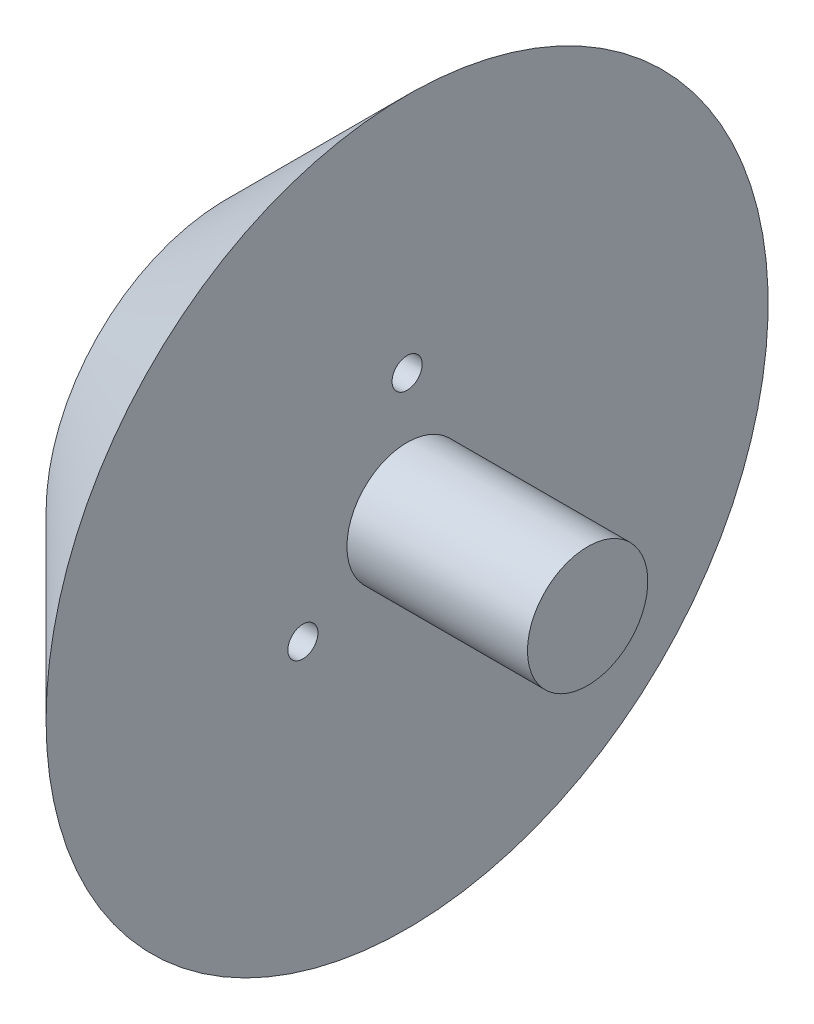
ISO-10303-21;
HEADER;
FILE_DESCRIPTION(('STEP AP214'),'2;1');
FILE_NAME('part.step','',(''),(''),'','','');
FILE_SCHEMA(('AUTOMOTIVE_DESIGN { 1 0 10303 214 1 1 1 1 }'));
ENDSEC;
DATA;
#1=APPLICATION_CONTEXT('core data for automotive mechanical design processes');
#2=APPLICATION_PROTOCOL_DEFINITION('international standard','automotive_design',2000,#1);
#3=PRODUCT_CONTEXT('',#1,'mechanical');
#4=PRODUCT('Part','Part','',(#3));
#5=PRODUCT_RELATED_PRODUCT_CATEGORY('part','',(#4));
#6=PRODUCT_DEFINITION_FORMATION('','',#4);
#7=PRODUCT_DEFINITION_CONTEXT('part definition',#1,'design');
#8=PRODUCT_DEFINITION('design','',#6,#7);
#9=PRODUCT_DEFINITION_SHAPE('','',#8);
#10=(LENGTH_UNIT() NAMED_UNIT(*) SI_UNIT(.MILLI.,.METRE.));
#11=(NAMED_UNIT(*) PLANE_ANGLE_UNIT() SI_UNIT($,.RADIAN.));
#12=(NAMED_UNIT(*) SI_UNIT($,.STERADIAN.) SOLID_ANGLE_UNIT());
#13=UNCERTAINTY_MEASURE_WITH_UNIT(LENGTH_MEASURE(1.E-05),#10,'distance_accuracy_value','');
#14=(GEOMETRIC_REPRESENTATION_CONTEXT(3) GLOBAL_UNCERTAINTY_ASSIGNED_CONTEXT((#13)) GLOBAL_UNIT_ASSIGNED_CONTEXT((#10,
#11,#12)) REPRESENTATION_CONTEXT('',''));
#15=CARTESIAN_POINT('',(0.,0.,0.));
#16=DIRECTION('',(0.,0.,1.));
#17=DIRECTION('',(1.,0.,0.));
#18=AXIS2_PLACEMENT_3D('',#15,#16,#17);
#19=CARTESIAN_POINT('',(3.49999999999988,0.,7.75));
#20=DIRECTION('',(-1.,0.,0.));
#21=DIRECTION('',(0.,0.,1.));
#22=AXIS2_PLACEMENT_3D('',#19,#20,#21);
#23=PLANE('',#22);
#24=CARTESIAN_POINT('',(3.49999999999988,1.,7.75));
#25=DIRECTION('',(-1.,0.,0.));
#26=DIRECTION('',(0.,0.,1.));
#27=AXIS2_PLACEMENT_3D('',#24,#25,#26);
#28=CIRCLE('',#27,0.124999999999999);
#29=CARTESIAN_POINT('',(3.49999999999988,1.,7.875));
#30=VERTEX_POINT('',#29);
#31=EDGE_CURVE('E59',#30,#30,#28,.T.);
#32=ORIENTED_EDGE('',*,*,#31,.T.);
#33=EDGE_LOOP('',(#32));
#34=FACE_BOUND('',#33,.T.);
#35=CARTESIAN_POINT('',(3.49999999999988,-0.499999999999981,8.61602540378448));
#36=DIRECTION('',(-1.,0.,0.));
#37=DIRECTION('',(0.,0.,1.));
#38=AXIS2_PLACEMENT_3D('',#35,#36,#37);
#39=CIRCLE('',#38,0.124999999999998);
#40=CARTESIAN_POINT('',(3.49999999999988,-0.499999999999981,8.74102540378448));
#41=VERTEX_POINT('',#40);
#42=EDGE_CURVE('E62',#41,#41,#39,.T.);
#43=ORIENTED_EDGE('',*,*,#42,.T.);
#44=EDGE_LOOP('',(#43));
#45=FACE_BOUND('',#44,.T.);
#46=CARTESIAN_POINT('',(3.49999999999988,-0.500000000000016,6.8839745962156));
#47=DIRECTION('',(-1.,0.,0.));
#48=DIRECTION('',(0.,0.,1.));
#49=AXIS2_PLACEMENT_3D('',#46,#47,#48);
#50=CIRCLE('',#49,0.124999999999999);
#51=CARTESIAN_POINT('',(3.49999999999988,-0.500000000000016,7.0089745962156));
#52=VERTEX_POINT('',#51);
#53=EDGE_CURVE('E65',#52,#52,#50,.T.);
#54=ORIENTED_EDGE('',*,*,#53,.T.);
#55=EDGE_LOOP('',(#54));
#56=FACE_BOUND('',#55,.T.);
#57=CARTESIAN_POINT('',(3.49999999999988,0.,7.75));
#58=DIRECTION('',(-1.,0.,0.));
#59=DIRECTION('',(0.,0.,1.));
#60=AXIS2_PLACEMENT_3D('',#57,#58,#59);
#61=CIRCLE('',#60,0.500000000000002);
#62=CARTESIAN_POINT('',(3.49999999999988,0.,8.25));
#63=VERTEX_POINT('',#62);
#64=EDGE_CURVE('E10',#63,#63,#61,.T.);
#65=ORIENTED_EDGE('',*,*,#64,.T.);
#66=EDGE_LOOP('',(#65));
#67=FACE_BOUND('',#66,.T.);
#68=CARTESIAN_POINT('',(3.49999999999988,0.,7.75));
#69=DIRECTION('',(-1.,0.,0.));
#70=DIRECTION('',(0.,0.,1.));
#71=AXIS2_PLACEMENT_3D('',#68,#69,#70);
#72=CIRCLE('',#71,3.);
#73=CARTESIAN_POINT('',(3.49999999999988,0.,10.75));
#74=VERTEX_POINT('',#73);
#75=EDGE_CURVE('E54',#74,#74,#72,.T.);
#76=ORIENTED_EDGE('',*,*,#75,.F.);
#77=EDGE_LOOP('',(#76));
#78=FACE_BOUND('',#77,.T.);
#79=ADVANCED_FACE('F39',(#34,#45,#56,#67,#78),#23,.F.);
#80=CARTESIAN_POINT('',(4.99999999999988,0.,7.75));
#81=DIRECTION('',(-1.,0.,0.));
#82=DIRECTION('',(0.,0.,1.));
#83=AXIS2_PLACEMENT_3D('',#80,#81,#82);
#84=CYLINDRICAL_SURFACE('',#83,0.500000000000002);
#85=CARTESIAN_POINT('',(4.99999999999988,0.,7.75));
#86=DIRECTION('',(-1.,0.,0.));
#87=DIRECTION('',(0.,0.,1.));
#88=AXIS2_PLACEMENT_3D('',#85,#86,#87);
#89=CIRCLE('',#88,0.500000000000002);
#90=CARTESIAN_POINT('',(4.99999999999988,0.,8.25));
#91=VERTEX_POINT('',#90);
#92=EDGE_CURVE('E46',#91,#91,#89,.T.);
#93=ORIENTED_EDGE('',*,*,#92,.T.);
#94=EDGE_LOOP('',(#93));
#95=FACE_BOUND('',#94,.T.);
#96=ORIENTED_EDGE('',*,*,#64,.F.);
#97=EDGE_LOOP('',(#96));
#98=FACE_BOUND('',#97,.T.);
#99=ADVANCED_FACE('F98',(#95,#98),#84,.T.);
#100=CARTESIAN_POINT('',(4.99999999999988,0.,7.75));
#101=DIRECTION('',(-1.,0.,0.));
#102=DIRECTION('',(0.,0.,1.));
#103=AXIS2_PLACEMENT_3D('',#100,#101,#102);
#104=PLANE('',#103);
#105=ORIENTED_EDGE('',*,*,#92,.F.);
#106=EDGE_LOOP('',(#105));
#107=FACE_BOUND('',#106,.T.);
#108=ADVANCED_FACE('F93',(#107),#104,.F.);
#109=CARTESIAN_POINT('',(3.49999999999988,0.,7.75));
#110=DIRECTION('',(1.,0.,0.));
#111=DIRECTION('',(0.,0.,-1.));
#112=AXIS2_PLACEMENT_3D('',#109,#110,#111);
#113=CONICAL_SURFACE('',#112,3.,0.785398163397443);
#114=CARTESIAN_POINT('',(1.99999999999988,0.,7.75));
#115=DIRECTION('',(-1.,0.,0.));
#116=DIRECTION('',(0.,0.,1.));
#117=AXIS2_PLACEMENT_3D('',#114,#115,#116);
#118=CIRCLE('',#117,1.50000000000002);
#119=CARTESIAN_POINT('',(1.99999999999988,0.,9.25000000000002));
#120=VERTEX_POINT('',#119);
#121=EDGE_CURVE('E50',#120,#120,#118,.T.);
#122=ORIENTED_EDGE('',*,*,#121,.F.);
#123=EDGE_LOOP('',(#122));
#124=FACE_BOUND('',#123,.T.);
#125=ORIENTED_EDGE('',*,*,#75,.T.);
#126=EDGE_LOOP('',(#125));
#127=FACE_BOUND('',#126,.T.);
#128=ADVANCED_FACE('F84',(#124,#127),#113,.T.);
#129=CARTESIAN_POINT('',(1.99999999999988,0.,7.75));
#130=DIRECTION('',(-1.,0.,0.));
#131=DIRECTION('',(0.,0.,1.));
#132=AXIS2_PLACEMENT_3D('',#129,#130,#131);
#133=PLANE('',#132);
#134=CARTESIAN_POINT('',(1.99999999999988,1.,7.75));
#135=DIRECTION('',(-1.,0.,0.));
#136=DIRECTION('',(0.,0.,1.));
#137=AXIS2_PLACEMENT_3D('',#134,#135,#136);
#138=CIRCLE('',#137,0.124999999999999);
#139=CARTESIAN_POINT('',(1.99999999999988,1.,7.875));
#140=VERTEX_POINT('',#139);
#141=EDGE_CURVE('E68',#140,#140,#138,.T.);
#142=ORIENTED_EDGE('',*,*,#141,.F.);
#143=EDGE_LOOP('',(#142));
#144=FACE_BOUND('',#143,.T.);
#145=CARTESIAN_POINT('',(1.99999999999988,-0.499999999999981,8.61602540378448));
#146=DIRECTION('',(-1.,0.,0.));
#147=DIRECTION('',(0.,0.,1.));
#148=AXIS2_PLACEMENT_3D('',#145,#146,#147);
#149=CIRCLE('',#148,0.124999999999998);
#150=CARTESIAN_POINT('',(1.99999999999988,-0.499999999999981,8.74102540378448));
#151=VERTEX_POINT('',#150);
#152=EDGE_CURVE('E72',#151,#151,#149,.T.);
#153=ORIENTED_EDGE('',*,*,#152,.F.);
#154=EDGE_LOOP('',(#153));
#155=FACE_BOUND('',#154,.T.);
#156=CARTESIAN_POINT('',(1.99999999999988,-0.500000000000016,6.8839745962156));
#157=DIRECTION('',(-1.,0.,0.));
#158=DIRECTION('',(0.,0.,1.));
#159=AXIS2_PLACEMENT_3D('',#156,#157,#158);
#160=CIRCLE('',#159,0.124999999999999);
#161=CARTESIAN_POINT('',(1.99999999999988,-0.500000000000016,7.0089745962156));
#162=VERTEX_POINT('',#161);
#163=EDGE_CURVE('E69',#162,#162,#160,.T.);
#164=ORIENTED_EDGE('',*,*,#163,.F.);
#165=EDGE_LOOP('',(#164));
#166=FACE_BOUND('',#165,.T.);
#167=ORIENTED_EDGE('',*,*,#121,.T.);
#168=EDGE_LOOP('',(#167));
#169=FACE_BOUND('',#168,.T.);
#170=ADVANCED_FACE('F41',(#144,#155,#166,#169),#133,.T.);
#171=CARTESIAN_POINT('',(4.99999999999988,-0.500000000000016,6.8839745962156));
#172=DIRECTION('',(-1.,0.,0.));
#173=DIRECTION('',(0.,0.,1.));
#174=AXIS2_PLACEMENT_3D('',#171,#172,#173);
#175=CYLINDRICAL_SURFACE('',#174,0.124999999999999);
#176=ORIENTED_EDGE('',*,*,#163,.T.);
#177=EDGE_LOOP('',(#176));
#178=FACE_BOUND('',#177,.T.);
#179=ORIENTED_EDGE('',*,*,#53,.F.);
#180=EDGE_LOOP('',(#179));
#181=FACE_BOUND('',#180,.T.);
#182=ADVANCED_FACE('F83',(#178,#181),#175,.F.);
#183=CARTESIAN_POINT('',(4.99999999999988,-0.499999999999981,8.61602540378448));
#184=DIRECTION('',(-1.,0.,0.));
#185=DIRECTION('',(0.,0.,1.));
#186=AXIS2_PLACEMENT_3D('',#183,#184,#185);
#187=CYLINDRICAL_SURFACE('',#186,0.124999999999998);
#188=ORIENTED_EDGE('',*,*,#152,.T.);
#189=EDGE_LOOP('',(#188));
#190=FACE_BOUND('',#189,.T.);
#191=ORIENTED_EDGE('',*,*,#42,.F.);
#192=EDGE_LOOP('',(#191));
#193=FACE_BOUND('',#192,.T.);
#194=ADVANCED_FACE('F111',(#190,#193),#187,.F.);
#195=CARTESIAN_POINT('',(4.99999999999988,1.,7.75));
#196=DIRECTION('',(-1.,0.,0.));
#197=DIRECTION('',(0.,0.,1.));
#198=AXIS2_PLACEMENT_3D('',#195,#196,#197);
#199=CYLINDRICAL_SURFACE('',#198,0.124999999999999);
#200=ORIENTED_EDGE('',*,*,#141,.T.);
#201=EDGE_LOOP('',(#200));
#202=FACE_BOUND('',#201,.T.);
#203=ORIENTED_EDGE('',*,*,#31,.F.);
#204=EDGE_LOOP('',(#203));
#205=FACE_BOUND('',#204,.T.);
#206=ADVANCED_FACE('F78',(#202,#205),#199,.F.);
#207=CLOSED_SHELL('',(#79,#99,#108,#128,#170,#182,#194,#206));
#208=MANIFOLD_SOLID_BREP('B2',#207);
#209=ADVANCED_BREP_SHAPE_REPRESENTATION('',(#18,#208),#14);
#210=SHAPE_DEFINITION_REPRESENTATION(#9,#209);
ENDSEC;
END-ISO-10303-21;
